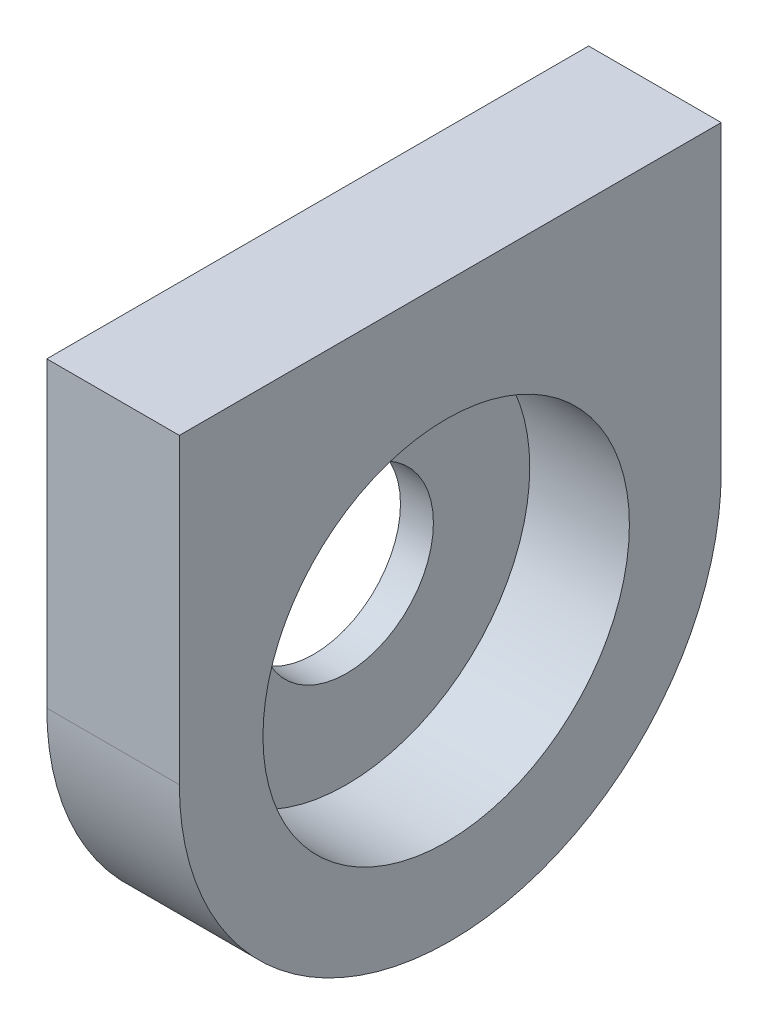
ISO-10303-21;
HEADER;
FILE_DESCRIPTION(('STEP AP214'),'2;1');
FILE_NAME('part.step','',(''),(''),'','','');
FILE_SCHEMA(('AUTOMOTIVE_DESIGN { 1 0 10303 214 1 1 1 1 }'));
ENDSEC;
DATA;
#1=APPLICATION_CONTEXT('core data for automotive mechanical design processes');
#2=APPLICATION_PROTOCOL_DEFINITION('international standard','automotive_design',2000,#1);
#3=PRODUCT_CONTEXT('',#1,'mechanical');
#4=PRODUCT('Part','Part','',(#3));
#5=PRODUCT_RELATED_PRODUCT_CATEGORY('part','',(#4));
#6=PRODUCT_DEFINITION_FORMATION('','',#4);
#7=PRODUCT_DEFINITION_CONTEXT('part definition',#1,'design');
#8=PRODUCT_DEFINITION('design','',#6,#7);
#9=PRODUCT_DEFINITION_SHAPE('','',#8);
#10=(LENGTH_UNIT() NAMED_UNIT(*) SI_UNIT(.MILLI.,.METRE.));
#11=(NAMED_UNIT(*) PLANE_ANGLE_UNIT() SI_UNIT($,.RADIAN.));
#12=(NAMED_UNIT(*) SI_UNIT($,.STERADIAN.) SOLID_ANGLE_UNIT());
#13=UNCERTAINTY_MEASURE_WITH_UNIT(LENGTH_MEASURE(1.E-05),#10,'distance_accuracy_value','');
#14=(GEOMETRIC_REPRESENTATION_CONTEXT(3) GLOBAL_UNCERTAINTY_ASSIGNED_CONTEXT((#13)) GLOBAL_UNIT_ASSIGNED_CONTEXT((#10,
#11,#12)) REPRESENTATION_CONTEXT('',''));
#15=CARTESIAN_POINT('',(0.,0.,0.));
#16=DIRECTION('',(0.,0.,1.));
#17=DIRECTION('',(1.,0.,0.));
#18=AXIS2_PLACEMENT_3D('',#15,#16,#17);
#19=CARTESIAN_POINT('',(2.,0.,0.));
#20=DIRECTION('',(1.,0.,0.));
#21=DIRECTION('',(0.,0.,-1.));
#22=AXIS2_PLACEMENT_3D('',#19,#20,#21);
#23=PLANE('',#22);
#24=CARTESIAN_POINT('',(2.,-15.,-76.9));
#25=DIRECTION('',(1.,0.,0.));
#26=DIRECTION('',(0.,0.,-1.));
#27=AXIS2_PLACEMENT_3D('',#24,#25,#26);
#28=CIRCLE('',#27,5.27499999999999);
#29=CARTESIAN_POINT('',(2.,-15.,-82.175));
#30=VERTEX_POINT('',#29);
#31=EDGE_CURVE('E105',#30,#30,#28,.T.);
#32=ORIENTED_EDGE('',*,*,#31,.F.);
#33=EDGE_LOOP('',(#32));
#34=FACE_BOUND('',#33,.T.);
#35=CARTESIAN_POINT('',(2.,-15.,-76.9));
#36=DIRECTION('',(1.,0.,0.));
#37=DIRECTION('',(0.,0.,-1.));
#38=AXIS2_PLACEMENT_3D('',#35,#36,#37);
#39=CIRCLE('',#38,11.125);
#40=CARTESIAN_POINT('',(2.,-15.,-88.025));
#41=VERTEX_POINT('',#40);
#42=EDGE_CURVE('E11',#41,#41,#39,.F.);
#43=ORIENTED_EDGE('',*,*,#42,.F.);
#44=EDGE_LOOP('',(#43));
#45=FACE_BOUND('',#44,.T.);
#46=ADVANCED_FACE('F38',(#34,#45),#23,.T.);
#47=CARTESIAN_POINT('',(2.,-15.,-77.15));
#48=DIRECTION('',(-1.,0.,0.));
#49=DIRECTION('',(0.,0.,1.));
#50=AXIS2_PLACEMENT_3D('',#47,#48,#49);
#51=CYLINDRICAL_SURFACE('',#50,16.45);
#52=CARTESIAN_POINT('',(0.,-15.,-77.15));
#53=DIRECTION('',(1.,0.,0.));
#54=DIRECTION('',(0.,0.,-1.));
#55=AXIS2_PLACEMENT_3D('',#52,#53,#54);
#56=CIRCLE('',#55,16.45);
#57=CARTESIAN_POINT('',(0.,-15.,-93.6));
#58=VERTEX_POINT('',#57);
#59=CARTESIAN_POINT('',(0.,-15.,-60.7));
#60=VERTEX_POINT('',#59);
#61=EDGE_CURVE('E81',#58,#60,#56,.F.);
#62=ORIENTED_EDGE('',*,*,#61,.F.);
#63=DIRECTION('',(-1.,0.,0.));
#64=VECTOR('',#63,1.);
#65=CARTESIAN_POINT('',(2.,-15.,-93.6));
#66=LINE('',#65,#64);
#67=CARTESIAN_POINT('',(8.05,-15.,-93.6));
#68=VERTEX_POINT('',#67);
#69=EDGE_CURVE('E46',#68,#58,#66,.T.);
#70=ORIENTED_EDGE('',*,*,#69,.F.);
#71=CARTESIAN_POINT('',(8.05,-15.,-77.15));
#72=DIRECTION('',(1.,0.,0.));
#73=DIRECTION('',(0.,0.,-1.));
#74=AXIS2_PLACEMENT_3D('',#71,#72,#73);
#75=CIRCLE('',#74,16.45);
#76=CARTESIAN_POINT('',(8.05,-15.,-60.7));
#77=VERTEX_POINT('',#76);
#78=EDGE_CURVE('E80',#77,#68,#75,.T.);
#79=ORIENTED_EDGE('',*,*,#78,.F.);
#80=DIRECTION('',(-1.,0.,0.));
#81=VECTOR('',#80,1.);
#82=CARTESIAN_POINT('',(2.,-15.,-60.7));
#83=LINE('',#82,#81);
#84=EDGE_CURVE('E53',#77,#60,#83,.T.);
#85=ORIENTED_EDGE('',*,*,#84,.T.);
#86=EDGE_LOOP('',(#62,#70,#79,#85));
#87=FACE_BOUND('',#86,.T.);
#88=ADVANCED_FACE('F40',(#87),#51,.T.);
#89=CARTESIAN_POINT('',(2.,0.,-93.6));
#90=DIRECTION('',(0.,0.,-1.));
#91=DIRECTION('',(-1.,0.,0.));
#92=AXIS2_PLACEMENT_3D('',#89,#90,#91);
#93=PLANE('',#92);
#94=DIRECTION('',(0.,-1.,0.));
#95=VECTOR('',#94,1.);
#96=CARTESIAN_POINT('',(0.,0.,-93.6));
#97=LINE('',#96,#95);
#98=CARTESIAN_POINT('',(0.,3.36816025984344,-93.6));
#99=VERTEX_POINT('',#98);
#100=EDGE_CURVE('E110',#99,#58,#97,.T.);
#101=ORIENTED_EDGE('',*,*,#100,.F.);
#102=DIRECTION('',(-1.,0.,0.));
#103=VECTOR('',#102,1.);
#104=CARTESIAN_POINT('',(2.,3.36816025984344,-93.6));
#105=LINE('',#104,#103);
#106=CARTESIAN_POINT('',(8.05,3.36816025984344,-93.6));
#107=VERTEX_POINT('',#106);
#108=EDGE_CURVE('E85',#107,#99,#105,.T.);
#109=ORIENTED_EDGE('',*,*,#108,.F.);
#110=DIRECTION('',(0.,1.,0.));
#111=VECTOR('',#110,1.);
#112=CARTESIAN_POINT('',(8.05,-15.,-93.6));
#113=LINE('',#112,#111);
#114=EDGE_CURVE('E87',#68,#107,#113,.T.);
#115=ORIENTED_EDGE('',*,*,#114,.F.);
#116=ORIENTED_EDGE('',*,*,#69,.T.);
#117=EDGE_LOOP('',(#101,#109,#115,#116));
#118=FACE_BOUND('',#117,.T.);
#119=ADVANCED_FACE('F88',(#118),#93,.T.);
#120=CARTESIAN_POINT('',(2.,3.36816025984344,0.));
#121=DIRECTION('',(0.,1.,0.));
#122=DIRECTION('',(0.,0.,1.));
#123=AXIS2_PLACEMENT_3D('',#120,#121,#122);
#124=PLANE('',#123);
#125=DIRECTION('',(0.,0.,-1.));
#126=VECTOR('',#125,1.);
#127=CARTESIAN_POINT('',(0.,3.36816025984344,0.));
#128=LINE('',#127,#126);
#129=CARTESIAN_POINT('',(0.,3.36816025984344,-60.7));
#130=VERTEX_POINT('',#129);
#131=EDGE_CURVE('E112',#130,#99,#128,.T.);
#132=ORIENTED_EDGE('',*,*,#131,.F.);
#133=DIRECTION('',(-1.,0.,0.));
#134=VECTOR('',#133,1.);
#135=CARTESIAN_POINT('',(2.,3.36816025984344,-60.7));
#136=LINE('',#135,#134);
#137=CARTESIAN_POINT('',(8.05,3.36816025984344,-60.7));
#138=VERTEX_POINT('',#137);
#139=EDGE_CURVE('E61',#138,#130,#136,.T.);
#140=ORIENTED_EDGE('',*,*,#139,.F.);
#141=DIRECTION('',(0.,0.,1.));
#142=VECTOR('',#141,1.);
#143=CARTESIAN_POINT('',(8.05,3.36816025984344,-93.6));
#144=LINE('',#143,#142);
#145=EDGE_CURVE('E92',#107,#138,#144,.T.);
#146=ORIENTED_EDGE('',*,*,#145,.F.);
#147=ORIENTED_EDGE('',*,*,#108,.T.);
#148=EDGE_LOOP('',(#132,#140,#146,#147));
#149=FACE_BOUND('',#148,.T.);
#150=ADVANCED_FACE('F123',(#149),#124,.T.);
#151=CARTESIAN_POINT('',(2.,0.,-60.7));
#152=DIRECTION('',(0.,0.,1.));
#153=DIRECTION('',(1.,0.,0.));
#154=AXIS2_PLACEMENT_3D('',#151,#152,#153);
#155=PLANE('',#154);
#156=DIRECTION('',(0.,1.,0.));
#157=VECTOR('',#156,1.);
#158=CARTESIAN_POINT('',(0.,0.,-60.7));
#159=LINE('',#158,#157);
#160=EDGE_CURVE('E115',#60,#130,#159,.T.);
#161=ORIENTED_EDGE('',*,*,#160,.F.);
#162=ORIENTED_EDGE('',*,*,#84,.F.);
#163=DIRECTION('',(0.,-1.,0.));
#164=VECTOR('',#163,1.);
#165=CARTESIAN_POINT('',(8.05,3.36816025984344,-60.7));
#166=LINE('',#165,#164);
#167=EDGE_CURVE('E97',#138,#77,#166,.T.);
#168=ORIENTED_EDGE('',*,*,#167,.F.);
#169=ORIENTED_EDGE('',*,*,#139,.T.);
#170=EDGE_LOOP('',(#161,#162,#168,#169));
#171=FACE_BOUND('',#170,.T.);
#172=ADVANCED_FACE('F127',(#171),#155,.T.);
#173=CARTESIAN_POINT('',(2.,-15.,-76.9));
#174=DIRECTION('',(-1.,0.,0.));
#175=DIRECTION('',(0.,0.,1.));
#176=AXIS2_PLACEMENT_3D('',#173,#174,#175);
#177=CYLINDRICAL_SURFACE('',#176,5.27499999999999);
#178=ORIENTED_EDGE('',*,*,#31,.T.);
#179=EDGE_LOOP('',(#178));
#180=FACE_BOUND('',#179,.T.);
#181=CARTESIAN_POINT('',(0.,-15.,-76.9));
#182=DIRECTION('',(1.,0.,0.));
#183=DIRECTION('',(0.,0.,-1.));
#184=AXIS2_PLACEMENT_3D('',#181,#182,#183);
#185=CIRCLE('',#184,5.27499999999999);
#186=CARTESIAN_POINT('',(0.,-15.,-82.175));
#187=VERTEX_POINT('',#186);
#188=EDGE_CURVE('E108',#187,#187,#185,.T.);
#189=ORIENTED_EDGE('',*,*,#188,.F.);
#190=EDGE_LOOP('',(#189));
#191=FACE_BOUND('',#190,.T.);
#192=ADVANCED_FACE('F129',(#180,#191),#177,.F.);
#193=CARTESIAN_POINT('',(0.,0.,0.));
#194=DIRECTION('',(1.,0.,0.));
#195=DIRECTION('',(0.,0.,-1.));
#196=AXIS2_PLACEMENT_3D('',#193,#194,#195);
#197=PLANE('',#196);
#198=ORIENTED_EDGE('',*,*,#61,.T.);
#199=ORIENTED_EDGE('',*,*,#160,.T.);
#200=ORIENTED_EDGE('',*,*,#131,.T.);
#201=ORIENTED_EDGE('',*,*,#100,.T.);
#202=EDGE_LOOP('',(#198,#199,#200,#201));
#203=FACE_BOUND('',#202,.T.);
#204=ORIENTED_EDGE('',*,*,#188,.T.);
#205=EDGE_LOOP('',(#204));
#206=FACE_BOUND('',#205,.T.);
#207=ADVANCED_FACE('F125',(#203,#206),#197,.F.);
#208=CARTESIAN_POINT('',(8.05,-15.,-77.15));
#209=DIRECTION('',(1.,0.,0.));
#210=DIRECTION('',(0.,0.,-1.));
#211=AXIS2_PLACEMENT_3D('',#208,#209,#210);
#212=PLANE('',#211);
#213=ORIENTED_EDGE('',*,*,#78,.T.);
#214=ORIENTED_EDGE('',*,*,#114,.T.);
#215=ORIENTED_EDGE('',*,*,#145,.T.);
#216=ORIENTED_EDGE('',*,*,#167,.T.);
#217=EDGE_LOOP('',(#213,#214,#215,#216));
#218=FACE_BOUND('',#217,.T.);
#219=CARTESIAN_POINT('',(8.05,-15.,-76.9));
#220=DIRECTION('',(1.,0.,0.));
#221=DIRECTION('',(0.,0.,-1.));
#222=AXIS2_PLACEMENT_3D('',#219,#220,#221);
#223=CIRCLE('',#222,11.125);
#224=CARTESIAN_POINT('',(8.05,-15.,-88.025));
#225=VERTEX_POINT('',#224);
#226=EDGE_CURVE('E98',#225,#225,#223,.T.);
#227=ORIENTED_EDGE('',*,*,#226,.F.);
#228=EDGE_LOOP('',(#227));
#229=FACE_BOUND('',#228,.T.);
#230=ADVANCED_FACE('F95',(#218,#229),#212,.T.);
#231=CARTESIAN_POINT('',(8.05,-15.,-76.9));
#232=DIRECTION('',(-1.,0.,0.));
#233=DIRECTION('',(0.,0.,1.));
#234=AXIS2_PLACEMENT_3D('',#231,#232,#233);
#235=CYLINDRICAL_SURFACE('',#234,11.125);
#236=ORIENTED_EDGE('',*,*,#226,.T.);
#237=EDGE_LOOP('',(#236));
#238=FACE_BOUND('',#237,.T.);
#239=ORIENTED_EDGE('',*,*,#42,.T.);
#240=EDGE_LOOP('',(#239));
#241=FACE_BOUND('',#240,.T.);
#242=ADVANCED_FACE('F153',(#238,#241),#235,.F.);
#243=CLOSED_SHELL('',(#46,#88,#119,#150,#172,#192,#207,#230,#242));
#244=MANIFOLD_SOLID_BREP('B2',#243);
#245=ADVANCED_BREP_SHAPE_REPRESENTATION('',(#18,#244),#14);
#246=SHAPE_DEFINITION_REPRESENTATION(#9,#245);
ENDSEC;
END-ISO-10303-21;
